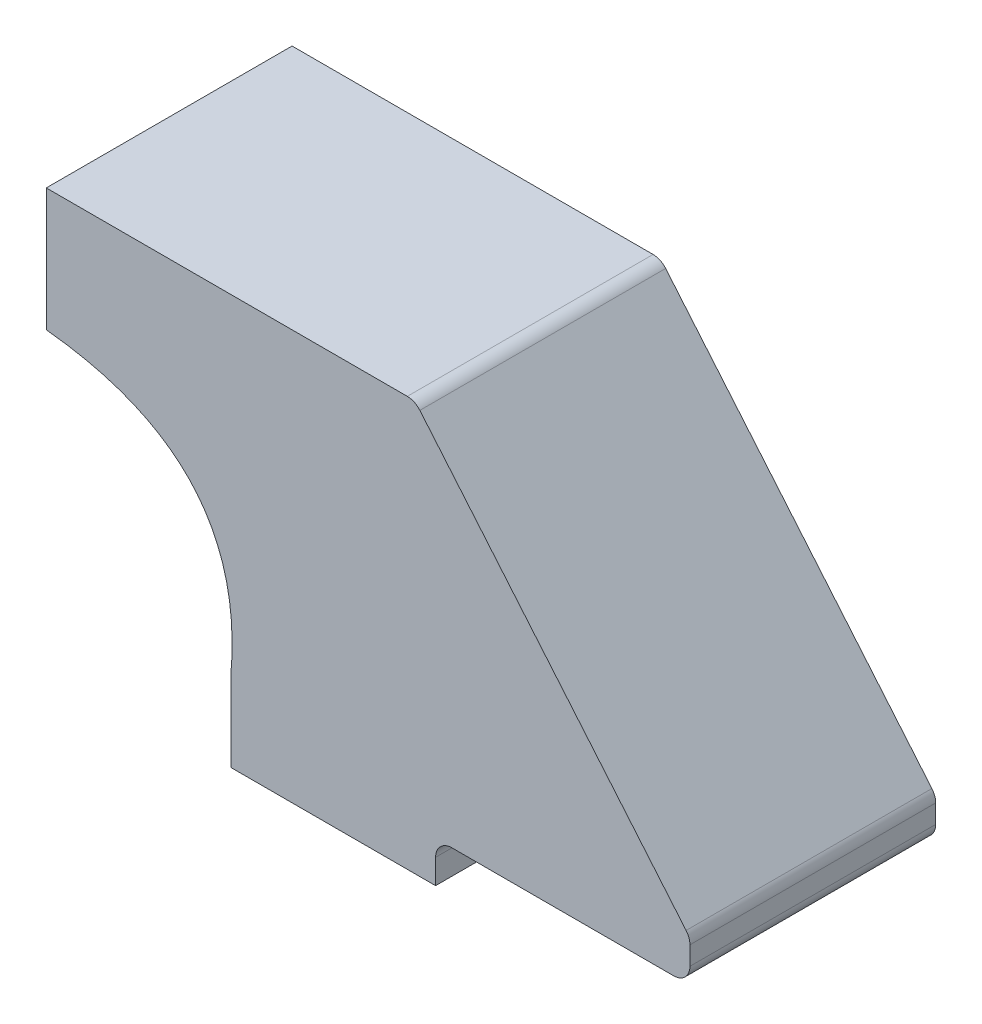
ISO-10303-21;
HEADER;
FILE_DESCRIPTION(('STEP AP214'),'2;1');
FILE_NAME('part.step','',(''),(''),'','','');
FILE_SCHEMA(('AUTOMOTIVE_DESIGN { 1 0 10303 214 1 1 1 1 }'));
ENDSEC;
DATA;
#1=APPLICATION_CONTEXT('core data for automotive mechanical design processes');
#2=APPLICATION_PROTOCOL_DEFINITION('international standard','automotive_design',2000,#1);
#3=PRODUCT_CONTEXT('',#1,'mechanical');
#4=PRODUCT('Part','Part','',(#3));
#5=PRODUCT_RELATED_PRODUCT_CATEGORY('part','',(#4));
#6=PRODUCT_DEFINITION_FORMATION('','',#4);
#7=PRODUCT_DEFINITION_CONTEXT('part definition',#1,'design');
#8=PRODUCT_DEFINITION('design','',#6,#7);
#9=PRODUCT_DEFINITION_SHAPE('','',#8);
#10=(LENGTH_UNIT() NAMED_UNIT(*) SI_UNIT(.MILLI.,.METRE.));
#11=(NAMED_UNIT(*) PLANE_ANGLE_UNIT() SI_UNIT($,.RADIAN.));
#12=(NAMED_UNIT(*) SI_UNIT($,.STERADIAN.) SOLID_ANGLE_UNIT());
#13=UNCERTAINTY_MEASURE_WITH_UNIT(LENGTH_MEASURE(1.E-05),#10,'distance_accuracy_value','');
#14=(GEOMETRIC_REPRESENTATION_CONTEXT(3) GLOBAL_UNCERTAINTY_ASSIGNED_CONTEXT((#13)) GLOBAL_UNIT_ASSIGNED_CONTEXT((#10,
#11,#12)) REPRESENTATION_CONTEXT('',''));
#15=CARTESIAN_POINT('',(0.,0.,0.));
#16=DIRECTION('',(0.,0.,1.));
#17=DIRECTION('',(1.,0.,0.));
#18=AXIS2_PLACEMENT_3D('',#15,#16,#17);
#19=CARTESIAN_POINT('',(-28.5977434712053,-19.05,38.1));
#20=CARTESIAN_POINT('',(2.69986255378224,-22.2822170331598,38.1));
#21=CARTESIAN_POINT('',(0.,-51.2255624771992,38.1));
#22=B_SPLINE_CURVE_WITH_KNOTS('',2,(#19,#20,#21),.UNSPECIFIED.,.F.,.F.,(3,3),(0.,1.),.UNSPECIFIED.);
#23=DIRECTION('',(0.,0.,-1.));
#24=VECTOR('',#23,1.);
#25=SURFACE_OF_LINEAR_EXTRUSION('',#22,#24);
#26=CARTESIAN_POINT('',(-26.4958079400741,-19.3012852246724,2.54));
#27=CARTESIAN_POINT('',(-25.9557707656117,-19.3749972889507,2.54));
#28=CARTESIAN_POINT('',(-25.4166666288395,-19.4558500524149,2.54));
#29=CARTESIAN_POINT('',(-24.339294769458,-19.6333532227759,2.54));
#30=CARTESIAN_POINT('',(-23.8010352820643,-19.7300534904347,2.54));
#31=CARTESIAN_POINT('',(-22.726857119988,-19.9404951627902,2.54));
#32=CARTESIAN_POINT('',(-22.19094420361,-20.0542661465355,2.54));
#33=CARTESIAN_POINT('',(-21.1230122561782,-20.3001806935425,2.54));
#34=CARTESIAN_POINT('',(-20.5909956160078,-20.4323346810761,2.54));
#35=CARTESIAN_POINT('',(-19.5184695832526,-20.7201501352653,2.54));
#36=CARTESIAN_POINT('',(-18.978099668573,-20.8763340203279,2.54));
#37=CARTESIAN_POINT('',(-17.9047676279952,-21.2111327289251,2.54));
#38=CARTESIAN_POINT('',(-17.3718002541145,-21.3897306548043,2.54));
#39=CARTESIAN_POINT('',(-16.3149971864087,-21.7710689894031,2.54));
#40=CARTESIAN_POINT('',(-15.7911548113677,-21.9737908029164,2.54));
#41=CARTESIAN_POINT('',(-14.7543694102743,-22.4052130995189,2.54));
#42=CARTESIAN_POINT('',(-14.2414239851874,-22.6339077926535,2.53999999999999));
#43=CARTESIAN_POINT('',(-13.2360045679206,-23.1155449071601,2.53999999999999));
#44=CARTESIAN_POINT('',(-12.7433427088365,-23.3680937266804,2.54));
#45=CARTESIAN_POINT('',(-11.773534971904,-23.9016036543832,2.54));
#46=CARTESIAN_POINT('',(-11.2963904925125,-24.1825673140414,2.54));
#47=CARTESIAN_POINT('',(-10.3606742810216,-24.7740572822391,2.54));
#48=CARTESIAN_POINT('',(-9.90210402626386,-25.0845859357396,2.54));
#49=CARTESIAN_POINT('',(-9.01114316764604,-25.7327624934599,2.54));
#50=CARTESIAN_POINT('',(-8.57854501851739,-26.0701243149015,2.54));
#51=CARTESIAN_POINT('',(-7.73819704809197,-26.774517807504,2.54));
#52=CARTESIAN_POINT('',(-7.33044621169315,-27.1415482651673,2.54));
#53=CARTESIAN_POINT('',(-6.54314195891344,-27.9044867770521,2.54));
#54=CARTESIAN_POINT('',(-6.1635777065943,-28.3003836167751,2.54000000000001));
#55=CARTESIAN_POINT('',(-5.50973185109996,-29.0360199435867,2.54000000000001));
#56=CARTESIAN_POINT('',(-5.22977254781658,-29.3707313588659,2.54));
#57=CARTESIAN_POINT('',(-4.69064949403554,-30.0564752110697,2.54));
#58=CARTESIAN_POINT('',(-4.43148390951828,-30.4075062042738,2.54));
#59=CARTESIAN_POINT('',(-3.93486758821132,-31.1245483653785,2.54));
#60=CARTESIAN_POINT('',(-3.69741482211093,-31.4905581287043,2.54));
#61=CARTESIAN_POINT('',(-3.24465178865981,-32.2362682135681,2.54));
#62=CARTESIAN_POINT('',(-3.02935270334118,-32.6159753194943,2.54));
#63=CARTESIAN_POINT('',(-2.62124381411061,-33.3873094038891,2.54));
#64=CARTESIAN_POINT('',(-2.42843573520121,-33.7789372937504,2.54));
#65=CARTESIAN_POINT('',(-2.0652185625317,-34.5724252186209,2.54));
#66=CARTESIAN_POINT('',(-1.89480927649679,-34.9742851657612,2.54));
#67=CARTESIAN_POINT('',(-1.58991206349808,-35.7511227029641,2.54));
#68=CARTESIAN_POINT('',(-1.45358652565678,-36.1253815134191,2.54));
#69=CARTESIAN_POINT('',(-1.19874454343556,-36.8799346043934,2.54));
#70=CARTESIAN_POINT('',(-1.08023040058279,-37.2602296578877,2.54));
#71=CARTESIAN_POINT('',(-0.750444123631098,-38.4087648347983,2.54));
#72=CARTESIAN_POINT('',(-0.564980306081429,-39.1845202247595,2.54));
#73=CARTESIAN_POINT('',(-0.255580736643248,-40.755484323278,2.54));
#74=CARTESIAN_POINT('',(-0.132237667139213,-41.5508071915305,2.54));
#75=CARTESIAN_POINT('',(0.00973123416477016,-42.7483248392847,2.54));
#76=CARTESIAN_POINT('',(0.0498735878991604,-43.1481164846251,2.54));
#77=CARTESIAN_POINT('',(0.116684103395654,-43.9488316581764,2.54));
#78=CARTESIAN_POINT('',(0.143352539245693,-44.3497551631959,2.54));
#79=CARTESIAN_POINT('',(0.180698431126576,-45.086608600095,2.54));
#80=CARTESIAN_POINT('',(0.193277691748724,-45.4224456958983,2.54));
#81=CARTESIAN_POINT('',(0.210031916751964,-46.0943257261361,2.54));
#82=CARTESIAN_POINT('',(0.214206961519863,-46.430368658571,2.54));
#83=CARTESIAN_POINT('',(0.21459098821829,-47.1025141793904,2.54));
#84=CARTESIAN_POINT('',(0.210798566716455,-47.4386167678557,2.54));
#85=CARTESIAN_POINT('',(0.195662953241587,-48.1106448198608,2.54));
#86=CARTESIAN_POINT('',(0.184319843025614,-48.446570285279,2.54));
#87=CARTESIAN_POINT('',(0.15445518202639,-49.1186504268928,2.54));
#88=CARTESIAN_POINT('',(0.135921956334129,-49.4548045836735,2.54));
#89=CARTESIAN_POINT('',(0.103021736347244,-49.9586976858475,2.54));
#90=CARTESIAN_POINT('',(0.0912047934665523,-50.1266073242175,2.54));
#91=CARTESIAN_POINT('',(0.0722378283837651,-50.3783775423077,2.54));
#92=CARTESIAN_POINT('',(0.0657086034207512,-50.4622849853913,2.54));
#93=CARTESIAN_POINT('',(0.0522418269266401,-50.6300668056189,2.54));
#94=CARTESIAN_POINT('',(0.0453042768016809,-50.7139411828758,2.54));
#95=CARTESIAN_POINT('',(0.0310127153121131,-50.8818148056851,2.54));
#96=CARTESIAN_POINT('',(0.0236579385392867,-50.9658139861098,2.54));
#97=CARTESIAN_POINT('',(0.0123264409846385,-51.0917859152644,2.54));
#98=CARTESIAN_POINT('',(0.00849937827909242,-51.1337721704541,2.54));
#99=CARTESIAN_POINT('',(0.000746184442811032,-51.2177355568533,2.54));
#100=CARTESIAN_POINT('',(-0.0031799468023312,-51.2597126880524,2.54));
#101=CARTESIAN_POINT('',(-0.0149439756448821,-51.3856459944654,2.54));
#102=CARTESIAN_POINT('',(-0.0227674534079408,-51.4696034972441,2.54));
#103=CARTESIAN_POINT('',(-0.0384244679292087,-51.637517413316,2.54));
#104=CARTESIAN_POINT('',(-0.046258004667978,-51.7214738266111,2.54));
#105=CARTESIAN_POINT('',(-0.0697559346057281,-51.9733442343365,2.54));
#106=CARTESIAN_POINT('',(-0.0854175622868351,-52.1412584833748,2.54));
#107=CARTESIAN_POINT('',(-0.116742722419435,-52.4770860381999,2.54));
#108=CARTESIAN_POINT('',(-0.132406254861969,-52.6449993439874,2.54));
#109=CARTESIAN_POINT('',(-0.163740666790729,-52.9809104309668,2.54));
#110=CARTESIAN_POINT('',(-0.179411546011187,-53.1489082121831,2.54));
#111=CARTESIAN_POINT('',(-0.210753462083882,-53.4849039659236,2.54));
#112=CARTESIAN_POINT('',(-0.226424498936288,-53.6529019384477,2.54));
#113=CARTESIAN_POINT('',(-0.273437433869644,-54.1568943854345,2.54));
#114=CARTESIAN_POINT('',(-0.304779293832285,-54.4928888634066,2.54));
#115=CARTESIAN_POINT('',(-0.366199500121553,-55.1513322664898,2.54));
#116=CARTESIAN_POINT('',(-0.396277845351759,-55.4737811917019,2.54));
#117=CARTESIAN_POINT('',(-0.456434558964557,-56.118679364381,2.54));
#118=CARTESIAN_POINT('',(-0.486512927347142,-56.4411286118479,2.54));
#119=CARTESIAN_POINT('',(-0.546642291580187,-57.0857336451108,2.54));
#120=CARTESIAN_POINT('',(-0.57669328742898,-57.407889430907,2.54));
#121=CARTESIAN_POINT('',(-0.636795270610364,-58.0522009163848,2.54));
#122=CARTESIAN_POINT('',(-0.666846257942957,-58.3743566160664,2.54));
#123=CARTESIAN_POINT('',(-0.756883058259493,-59.3395784252391,2.54));
#124=CARTESIAN_POINT('',(-0.816868871373646,-59.9826445347183,2.54));
#125=CARTESIAN_POINT('',(-0.93666288458301,-61.2668726891861,2.54));
#126=CARTESIAN_POINT('',(-0.996471084678479,-61.9080347341747,2.54));
#127=CARTESIAN_POINT('',(-1.11584842885532,-63.1877960711733,2.54));
#128=CARTESIAN_POINT('',(-1.17541757293669,-63.8263953631832,2.54));
#129=CARTESIAN_POINT('',(-1.23498671706094,-64.4649946551892,2.54));
#130=B_SPLINE_CURVE_WITH_KNOTS('',3,(#26,#27,#28,#29,#30,#31,#32,#33,#34,#35,#36,#37,#38,#39,
#40,#41,#42,#43,#44,#45,#46,#47,#48,#49,#50,#51,#52,#53,#54,#55,#56,#57,#58,#59,#60,#61,#62,#63,
#64,#65,#66,#67,#68,#69,#70,#71,#72,#73,#74,#75,#76,#77,#78,#79,#80,#81,#82,#83,#84,#85,#86,#87,
#88,#89,#90,#91,#92,#93,#94,#95,#96,#97,#98,#99,#100,#101,#102,#103,#104,#105,#106,#107,#108,
#109,#110,#111,#112,#113,#114,#115,#116,#117,#118,#119,#120,#121,#122,#123,#124,#125,#126,#127,
#128,#129),.UNSPECIFIED.,.F.,.F.,(4,2,2,2,2,2,2,2,2,2,2,2,2,2,2,2,2,2,2,2,2,2,2,2,2,2,2,2,2,2,2,
2,2,2,2,2,2,2,2,2,2,2,2,2,2,2,2,2,2,2,2,4),(0.,1.63514749955666,3.27554205045754,
4.91881251708361,6.5630186449295,8.25002950031331,9.9357760950722,11.6202315963421,
13.3043123279317,14.96430558758,16.6244480368573,18.2847222709594,19.9292025484174,
21.5736155978424,23.2173931673679,24.525707100587,25.833905512517,27.1419815331391,
28.4507145970962,29.7595479716188,31.0683701101735,32.2628438878356,33.4574718788287,
35.8471596836088,38.2592344979708,39.4644540558057,40.6696490959432,41.6777637978086,
42.685868856953,43.6941515040327,44.7024232338456,45.7123390379198,46.2173067327811,
46.4697890364916,46.7222704707868,46.9752310867847,47.1017119113925,47.2281928820704,
47.4811565868982,47.7341198035832,48.2400489885587,48.7459758795682,49.2521571504102,
49.7583390361132,50.7706983660357,51.7422446315126,52.7137918660509,53.684454894119,
54.6551176625889,56.5926911116277,58.5245275691452,60.4486423911192),.UNSPECIFIED.);
#131=CARTESIAN_POINT('',(-26.0577434712053,-19.3626774049444,2.53999999999997));
#132=VERTEX_POINT('',#131);
#133=CARTESIAN_POINT('',(0.,-51.2255624771992,2.54));
#134=VERTEX_POINT('',#133);
#135=EDGE_CURVE('E423',#132,#134,#130,.T.);
#136=ORIENTED_EDGE('',*,*,#135,.F.);
#137=DIRECTION('',(0.,0.,-1.));
#138=VECTOR('',#137,1.);
#139=CARTESIAN_POINT('',(-26.0577434712053,-19.3626774049444,35.56));
#140=LINE('',#139,#138);
#141=CARTESIAN_POINT('',(-26.0577434712053,-19.3626774049444,35.56));
#142=VERTEX_POINT('',#141);
#143=EDGE_CURVE('E189',#142,#132,#140,.T.);
#144=ORIENTED_EDGE('',*,*,#143,.F.);
#145=CARTESIAN_POINT('',(-26.0577434712053,-19.3626774049444,35.56));
#146=CARTESIAN_POINT('',(-25.445318622715,-19.4508219604254,35.56));
#147=CARTESIAN_POINT('',(-24.8341690756254,-19.5483484009053,35.56));
#148=CARTESIAN_POINT('',(-23.6119762934163,-19.764666402573,35.56));
#149=CARTESIAN_POINT('',(-23.000954509338,-19.8835787885162,35.56));
#150=CARTESIAN_POINT('',(-21.7817850744743,-20.1446061402233,35.56));
#151=CARTESIAN_POINT('',(-21.1736530727,-20.2867947795604,35.56));
#152=CARTESIAN_POINT('',(-19.9631109866169,-20.5964203953035,35.56));
#153=CARTESIAN_POINT('',(-19.360707866321,-20.7638847397435,35.56));
#154=CARTESIAN_POINT('',(-18.1520025660107,-21.1299367303092,35.56));
#155=CARTESIAN_POINT('',(-17.5458699246526,-21.3290876954924,35.56));
#156=CARTESIAN_POINT('',(-16.3455422514703,-21.7582216415561,35.56));
#157=CARTESIAN_POINT('',(-15.7513312943246,-21.9881598359001,35.56));
#158=CARTESIAN_POINT('',(-14.5779166089599,-22.4812834266235,35.56));
#159=CARTESIAN_POINT('',(-13.9986902708036,-22.7444147286965,35.56));
#160=CARTESIAN_POINT('',(-12.8583638597434,-23.3064296173739,35.56));
#161=CARTESIAN_POINT('',(-12.2972491116692,-23.6052832863234,35.56));
#162=CARTESIAN_POINT('',(-11.1852103717051,-24.2477719124819,35.56));
#163=CARTESIAN_POINT('',(-10.634754710607,-24.5922220100769,35.56));
#164=CARTESIAN_POINT('',(-9.56173511779487,-25.3223495315745,35.56));
#165=CARTESIAN_POINT('',(-9.03917372401397,-25.7080306972928,35.56));
#166=CARTESIAN_POINT('',(-8.03084278482968,-26.5184179245708,35.56));
#167=CARTESIAN_POINT('',(-7.54484725847523,-26.942840843158,35.56));
#168=CARTESIAN_POINT('',(-6.844679136364,-27.6095446582624,35.56));
#169=CARTESIAN_POINT('',(-6.6160700148165,-27.8368179220066,35.56));
#170=CARTESIAN_POINT('',(-6.16903153021002,-28.3011547687067,35.56));
#171=CARTESIAN_POINT('',(-5.95060146404475,-28.5382176733147,35.56));
#172=CARTESIAN_POINT('',(-5.45149423954803,-29.1046468286921,35.56));
#173=CARTESIAN_POINT('',(-5.17511887816372,-29.4378194476253,35.56));
#174=CARTESIAN_POINT('',(-4.64287883459588,-30.120182491696,35.56));
#175=CARTESIAN_POINT('',(-4.38701540293546,-30.4693738913915,35.56));
#176=CARTESIAN_POINT('',(-3.89669149018374,-31.182436745962,35.56));
#177=CARTESIAN_POINT('',(-3.66222954597202,-31.5463071948422,35.56));
#178=CARTESIAN_POINT('',(-3.21479852648344,-32.2879865464561,35.56));
#179=CARTESIAN_POINT('',(-3.00187219187933,-32.6658212109335,35.56));
#180=CARTESIAN_POINT('',(-2.59822632563413,-33.4331847956511,35.56));
#181=CARTESIAN_POINT('',(-2.40750812017844,-33.8227144125243,35.56));
#182=CARTESIAN_POINT('',(-2.04816411861858,-34.6118405563179,35.56));
#183=CARTESIAN_POINT('',(-1.8795394172039,-35.0114375808897,35.56));
#184=CARTESIAN_POINT('',(-1.57724920205004,-35.7851433538693,35.56));
#185=CARTESIAN_POINT('',(-1.44183664211348,-36.1585717345515,35.56));
#186=CARTESIAN_POINT('',(-1.18870748060374,-36.9113971814896,35.56));
#187=CARTESIAN_POINT('',(-1.07099316061851,-37.2907950103508,35.56));
#188=CARTESIAN_POINT('',(-0.743483606361877,-38.4364072495384,35.56));
#189=CARTESIAN_POINT('',(-0.559313549979998,-39.2100617629157,35.56));
#190=CARTESIAN_POINT('',(-0.253052914095378,-40.7716620829401,35.56));
#191=CARTESIAN_POINT('',(-0.131153191224365,-41.559644250962,35.56));
#192=CARTESIAN_POINT('',(0.0563721911275352,-43.1420557092505,35.56));
#193=CARTESIAN_POINT('',(0.1220062728133,-43.9364840166397,35.56));
#194=CARTESIAN_POINT('',(0.190543355707248,-45.2756119531217,35.56));
#195=CARTESIAN_POINT('',(0.206731841372172,-45.8197014794603,35.56));
#196=CARTESIAN_POINT('',(0.217767616616003,-46.9080460356857,35.56));
#197=CARTESIAN_POINT('',(0.21261699052243,-47.4523010442163,35.56));
#198=CARTESIAN_POINT('',(0.182901085652123,-48.5354298531144,35.56));
#199=CARTESIAN_POINT('',(0.158507930713822,-49.0743086713822,35.56));
#200=CARTESIAN_POINT('',(0.0920868950302436,-50.1509123013231,35.56));
#201=CARTESIAN_POINT('',(0.0500614422016279,-50.6886372616367,35.56));
#202=CARTESIAN_POINT('',(0.,-51.2255624771992,35.56));
#203=B_SPLINE_CURVE_WITH_KNOTS('',3,(#145,#146,#147,#148,#149,#150,#151,#152,#153,#154,#155,
#156,#157,#158,#159,#160,#161,#162,#163,#164,#165,#166,#167,#168,#169,#170,#171,#172,#173,#174,
#175,#176,#177,#178,#179,#180,#181,#182,#183,#184,#185,#186,#187,#188,#189,#190,#191,#192,#193,
#194,#195,#196,#197,#198,#199,#200,#201,#202),.UNSPECIFIED.,.F.,.F.,(4,2,2,2,2,2,2,2,2,2,2,2,2,
2,2,2,2,2,2,2,2,2,2,2,2,2,2,2,4),(0.,1.85624480614655,3.72332663699667,5.59643663226554,
7.47158954029138,9.38484863965487,11.2953541400521,13.2027853967572,15.1086302183605,
17.0548845217535,19.0013156024513,20.9345135993706,21.9013287624093,22.8680770445389,
24.1659168526294,25.4638357242893,26.7616657966947,28.062023048726,29.3624579133905,
30.6629571876863,31.8541575129284,33.0455112716311,35.4281504050151,37.8180490851815,
40.2075899673697,41.8401851332693,43.4726208369174,45.0906177906097,46.7083920238602),.UNSPECIFIED.);
#204=CARTESIAN_POINT('',(0.,-51.2255624771992,35.56));
#205=VERTEX_POINT('',#204);
#206=EDGE_CURVE('E328',#142,#205,#203,.T.);
#207=ORIENTED_EDGE('',*,*,#206,.T.);
#208=DIRECTION('',(0.,0.,-1.));
#209=VECTOR('',#208,1.);
#210=CARTESIAN_POINT('',(0.,-51.2255624771992,38.1));
#211=LINE('',#210,#209);
#212=CARTESIAN_POINT('',(0.,-51.2255624771992,38.1));
#213=VERTEX_POINT('',#212);
#214=EDGE_CURVE('E265',#213,#205,#211,.T.);
#215=ORIENTED_EDGE('',*,*,#214,.F.);
#216=CARTESIAN_POINT('',(-28.5977434712053,-19.05,38.1));
#217=VERTEX_POINT('',#216);
#218=EDGE_CURVE('E121',#217,#213,#22,.T.);
#219=ORIENTED_EDGE('',*,*,#218,.F.);
#220=DIRECTION('',(0.,0.,-1.));
#221=VECTOR('',#220,1.);
#222=CARTESIAN_POINT('',(-28.5977434712053,-19.05,38.1));
#223=LINE('',#222,#221);
#224=CARTESIAN_POINT('',(-28.5977434712053,-19.05,0.));
#225=VERTEX_POINT('',#224);
#226=EDGE_CURVE('E48',#217,#225,#223,.T.);
#227=ORIENTED_EDGE('',*,*,#226,.T.);
#228=CARTESIAN_POINT('',(-28.5977434712053,-19.05,0.));
#229=CARTESIAN_POINT('',(2.69986255378224,-22.2822170331598,0.));
#230=CARTESIAN_POINT('',(0.,-51.2255624771992,0.));
#231=B_SPLINE_CURVE_WITH_KNOTS('',2,(#228,#229,#230),.UNSPECIFIED.,.F.,.F.,(3,3),(0.,1.),.UNSPECIFIED.);
#232=CARTESIAN_POINT('',(0.,-51.2255624771992,0.));
#233=VERTEX_POINT('',#232);
#234=EDGE_CURVE('E188',#225,#233,#231,.T.);
#235=ORIENTED_EDGE('',*,*,#234,.T.);
#236=EDGE_CURVE('E264',#134,#233,#211,.T.);
#237=ORIENTED_EDGE('',*,*,#236,.F.);
#238=EDGE_LOOP('',(#136,#144,#207,#215,#219,#227,#235,#237));
#239=FACE_BOUND('',#238,.T.);
#240=ADVANCED_FACE('F39',(#239),#25,.F.);
#241=CARTESIAN_POINT('',(0.,-51.2255624771992,38.1));
#242=DIRECTION('',(1.,0.,0.));
#243=DIRECTION('',(0.,0.,-1.));
#244=AXIS2_PLACEMENT_3D('',#241,#242,#243);
#245=PLANE('',#244);
#246=DIRECTION('',(0.,-1.,0.));
#247=VECTOR('',#246,1.);
#248=CARTESIAN_POINT('',(0.,-51.2255624771992,2.54));
#249=LINE('',#248,#247);
#250=CARTESIAN_POINT('',(0.,-60.96,2.54));
#251=VERTEX_POINT('',#250);
#252=EDGE_CURVE('E432',#134,#251,#249,.T.);
#253=ORIENTED_EDGE('',*,*,#252,.F.);
#254=ORIENTED_EDGE('',*,*,#236,.T.);
#255=DIRECTION('',(0.,-1.,0.));
#256=VECTOR('',#255,1.);
#257=CARTESIAN_POINT('',(0.,-51.2255624771992,0.));
#258=LINE('',#257,#256);
#259=CARTESIAN_POINT('',(0.,-63.5,0.));
#260=VERTEX_POINT('',#259);
#261=EDGE_CURVE('E195',#233,#260,#258,.T.);
#262=ORIENTED_EDGE('',*,*,#261,.T.);
#263=DIRECTION('',(0.,0.,-1.));
#264=VECTOR('',#263,1.);
#265=CARTESIAN_POINT('',(0.,-63.5,38.1));
#266=LINE('',#265,#264);
#267=CARTESIAN_POINT('',(0.,-63.5,38.1));
#268=VERTEX_POINT('',#267);
#269=EDGE_CURVE('E260',#268,#260,#266,.T.);
#270=ORIENTED_EDGE('',*,*,#269,.F.);
#271=DIRECTION('',(0.,-1.,0.));
#272=VECTOR('',#271,1.);
#273=CARTESIAN_POINT('',(0.,-51.2255624771992,38.1));
#274=LINE('',#273,#272);
#275=EDGE_CURVE('E293',#213,#268,#274,.T.);
#276=ORIENTED_EDGE('',*,*,#275,.F.);
#277=ORIENTED_EDGE('',*,*,#214,.T.);
#278=DIRECTION('',(0.,-1.,0.));
#279=VECTOR('',#278,1.);
#280=CARTESIAN_POINT('',(0.,-51.2255624771992,35.56));
#281=LINE('',#280,#279);
#282=CARTESIAN_POINT('',(0.,-60.96,35.56));
#283=VERTEX_POINT('',#282);
#284=EDGE_CURVE('E443',#205,#283,#281,.T.);
#285=ORIENTED_EDGE('',*,*,#284,.T.);
#286=DIRECTION('',(0.,0.,-1.));
#287=VECTOR('',#286,1.);
#288=CARTESIAN_POINT('',(0.,-60.96,38.1));
#289=LINE('',#288,#287);
#290=EDGE_CURVE('E439',#283,#251,#289,.T.);
#291=ORIENTED_EDGE('',*,*,#290,.T.);
#292=EDGE_LOOP('',(#253,#254,#262,#270,#276,#277,#285,#291));
#293=FACE_BOUND('',#292,.T.);
#294=ADVANCED_FACE('F283',(#293),#245,.F.);
#295=CARTESIAN_POINT('',(-28.5977434712053,0.,38.1));
#296=DIRECTION('',(1.,0.,0.));
#297=DIRECTION('',(0.,1.,0.));
#298=AXIS2_PLACEMENT_3D('',#295,#296,#297);
#299=PLANE('',#298);
#300=DIRECTION('',(0.,-1.,0.));
#301=VECTOR('',#300,1.);
#302=CARTESIAN_POINT('',(-28.5977434712053,0.,0.));
#303=LINE('',#302,#301);
#304=CARTESIAN_POINT('',(-28.5977434712053,0.,0.));
#305=VERTEX_POINT('',#304);
#306=EDGE_CURVE('E184',#305,#225,#303,.T.);
#307=ORIENTED_EDGE('',*,*,#306,.T.);
#308=ORIENTED_EDGE('',*,*,#226,.F.);
#309=DIRECTION('',(0.,-1.,0.));
#310=VECTOR('',#309,1.);
#311=CARTESIAN_POINT('',(-28.5977434712053,0.,38.1));
#312=LINE('',#311,#310);
#313=CARTESIAN_POINT('',(-28.5977434712053,0.,38.1));
#314=VERTEX_POINT('',#313);
#315=EDGE_CURVE('E229',#314,#217,#312,.T.);
#316=ORIENTED_EDGE('',*,*,#315,.F.);
#317=DIRECTION('',(0.,0.,-1.));
#318=VECTOR('',#317,1.);
#319=CARTESIAN_POINT('',(-28.5977434712053,0.,38.1));
#320=LINE('',#319,#318);
#321=EDGE_CURVE('E180',#314,#305,#320,.T.);
#322=ORIENTED_EDGE('',*,*,#321,.T.);
#323=EDGE_LOOP('',(#307,#308,#316,#322));
#324=FACE_BOUND('',#323,.T.);
#325=ADVANCED_FACE('F41',(#324),#299,.F.);
#326=CARTESIAN_POINT('',(0.,-63.5,38.1));
#327=DIRECTION('',(0.,1.,0.));
#328=DIRECTION('',(0.,0.,1.));
#329=AXIS2_PLACEMENT_3D('',#326,#327,#328);
#330=PLANE('',#329);
#331=DIRECTION('',(1.,0.,0.));
#332=VECTOR('',#331,1.);
#333=CARTESIAN_POINT('',(0.,-63.5,0.));
#334=LINE('',#333,#332);
#335=CARTESIAN_POINT('',(31.75,-63.5,0.));
#336=VERTEX_POINT('',#335);
#337=EDGE_CURVE('E201',#260,#336,#334,.T.);
#338=ORIENTED_EDGE('',*,*,#337,.T.);
#339=DIRECTION('',(0.,0.,-1.));
#340=VECTOR('',#339,1.);
#341=CARTESIAN_POINT('',(31.75,-63.5,38.1));
#342=LINE('',#341,#340);
#343=CARTESIAN_POINT('',(31.75,-63.5,38.1));
#344=VERTEX_POINT('',#343);
#345=EDGE_CURVE('E256',#344,#336,#342,.T.);
#346=ORIENTED_EDGE('',*,*,#345,.F.);
#347=DIRECTION('',(1.,0.,0.));
#348=VECTOR('',#347,1.);
#349=CARTESIAN_POINT('',(0.,-63.5,38.1));
#350=LINE('',#349,#348);
#351=EDGE_CURVE('E289',#268,#344,#350,.T.);
#352=ORIENTED_EDGE('',*,*,#351,.F.);
#353=ORIENTED_EDGE('',*,*,#269,.T.);
#354=EDGE_LOOP('',(#338,#346,#352,#353));
#355=FACE_BOUND('',#354,.T.);
#356=ADVANCED_FACE('F287',(#355),#330,.F.);
#357=CARTESIAN_POINT('',(31.75,-63.5,38.1));
#358=DIRECTION('',(-1.,0.,0.));
#359=DIRECTION('',(0.,0.,1.));
#360=AXIS2_PLACEMENT_3D('',#357,#358,#359);
#361=PLANE('',#360);
#362=DIRECTION('',(0.,1.,0.));
#363=VECTOR('',#362,1.);
#364=CARTESIAN_POINT('',(31.75,-63.5,0.));
#365=LINE('',#364,#363);
#366=CARTESIAN_POINT('',(31.75,-59.69,0.));
#367=VERTEX_POINT('',#366);
#368=EDGE_CURVE('E204',#336,#367,#365,.T.);
#369=ORIENTED_EDGE('',*,*,#368,.T.);
#370=DIRECTION('',(0.,0.,-1.));
#371=VECTOR('',#370,1.);
#372=CARTESIAN_POINT('',(31.75,-59.69,38.1));
#373=LINE('',#372,#371);
#374=CARTESIAN_POINT('',(31.75,-59.69,38.1));
#375=VERTEX_POINT('',#374);
#376=EDGE_CURVE('E252',#375,#367,#373,.T.);
#377=ORIENTED_EDGE('',*,*,#376,.F.);
#378=DIRECTION('',(0.,1.,0.));
#379=VECTOR('',#378,1.);
#380=CARTESIAN_POINT('',(31.75,-63.5,38.1));
#381=LINE('',#380,#379);
#382=EDGE_CURVE('E292',#344,#375,#381,.T.);
#383=ORIENTED_EDGE('',*,*,#382,.F.);
#384=ORIENTED_EDGE('',*,*,#345,.T.);
#385=EDGE_LOOP('',(#369,#377,#383,#384));
#386=FACE_BOUND('',#385,.T.);
#387=ADVANCED_FACE('F348',(#386),#361,.F.);
#388=CARTESIAN_POINT('',(34.29,-59.69,38.1));
#389=DIRECTION('',(0.,0.,-1.));
#390=DIRECTION('',(-1.,0.,0.));
#391=AXIS2_PLACEMENT_3D('',#388,#389,#390);
#392=CYLINDRICAL_SURFACE('',#391,2.54);
#393=CARTESIAN_POINT('',(34.29,-59.69,0.));
#394=DIRECTION('',(0.,0.,-1.));
#395=DIRECTION('',(-1.,0.,0.));
#396=AXIS2_PLACEMENT_3D('',#393,#394,#395);
#397=CIRCLE('',#396,2.54);
#398=CARTESIAN_POINT('',(34.29,-57.15,0.));
#399=VERTEX_POINT('',#398);
#400=EDGE_CURVE('E207',#367,#399,#397,.T.);
#401=ORIENTED_EDGE('',*,*,#400,.T.);
#402=DIRECTION('',(0.,0.,-1.));
#403=VECTOR('',#402,1.);
#404=CARTESIAN_POINT('',(34.29,-57.15,38.1));
#405=LINE('',#404,#403);
#406=CARTESIAN_POINT('',(34.29,-57.15,38.1));
#407=VERTEX_POINT('',#406);
#408=EDGE_CURVE('E248',#407,#399,#405,.T.);
#409=ORIENTED_EDGE('',*,*,#408,.F.);
#410=CARTESIAN_POINT('',(34.29,-59.69,38.1));
#411=DIRECTION('',(0.,0.,-1.));
#412=DIRECTION('',(-1.,0.,0.));
#413=AXIS2_PLACEMENT_3D('',#410,#411,#412);
#414=CIRCLE('',#413,2.54);
#415=EDGE_CURVE('E297',#375,#407,#414,.T.);
#416=ORIENTED_EDGE('',*,*,#415,.F.);
#417=ORIENTED_EDGE('',*,*,#376,.T.);
#418=EDGE_LOOP('',(#401,#409,#416,#417));
#419=FACE_BOUND('',#418,.T.);
#420=ADVANCED_FACE('F351',(#419),#392,.F.);
#421=CARTESIAN_POINT('',(68.638517792601,-57.15,38.1));
#422=DIRECTION('',(0.,1.,0.));
#423=DIRECTION('',(-1.,0.,0.));
#424=AXIS2_PLACEMENT_3D('',#421,#422,#423);
#425=PLANE('',#424);
#426=DIRECTION('',(1.,0.,0.));
#427=VECTOR('',#426,1.);
#428=CARTESIAN_POINT('',(68.638517792601,-57.15,0.));
#429=LINE('',#428,#427);
#430=CARTESIAN_POINT('',(68.638517792601,-57.15,0.));
#431=VERTEX_POINT('',#430);
#432=EDGE_CURVE('E210',#399,#431,#429,.T.);
#433=ORIENTED_EDGE('',*,*,#432,.T.);
#434=DIRECTION('',(0.,0.,-1.));
#435=VECTOR('',#434,1.);
#436=CARTESIAN_POINT('',(68.638517792601,-57.15,38.1));
#437=LINE('',#436,#435);
#438=CARTESIAN_POINT('',(68.638517792601,-57.15,38.1));
#439=VERTEX_POINT('',#438);
#440=EDGE_CURVE('E244',#439,#431,#437,.T.);
#441=ORIENTED_EDGE('',*,*,#440,.F.);
#442=DIRECTION('',(1.,0.,0.));
#443=VECTOR('',#442,1.);
#444=CARTESIAN_POINT('',(68.638517792601,-57.15,38.1));
#445=LINE('',#444,#443);
#446=EDGE_CURVE('E304',#407,#439,#445,.T.);
#447=ORIENTED_EDGE('',*,*,#446,.F.);
#448=ORIENTED_EDGE('',*,*,#408,.T.);
#449=EDGE_LOOP('',(#433,#441,#447,#448));
#450=FACE_BOUND('',#449,.T.);
#451=ADVANCED_FACE('F355',(#450),#425,.F.);
#452=CARTESIAN_POINT('',(68.638517792601,-54.61,38.1));
#453=DIRECTION('',(0.,0.,-1.));
#454=DIRECTION('',(-1.,0.,0.));
#455=AXIS2_PLACEMENT_3D('',#452,#453,#454);
#456=CYLINDRICAL_SURFACE('',#455,2.54);
#457=CARTESIAN_POINT('',(68.638517792601,-54.61,0.));
#458=DIRECTION('',(0.,0.,1.));
#459=DIRECTION('',(-1.,0.,0.));
#460=AXIS2_PLACEMENT_3D('',#457,#458,#459);
#461=CIRCLE('',#460,2.54);
#462=CARTESIAN_POINT('',(71.178517792601,-54.61,0.));
#463=VERTEX_POINT('',#462);
#464=EDGE_CURVE('E213',#431,#463,#461,.T.);
#465=ORIENTED_EDGE('',*,*,#464,.T.);
#466=DIRECTION('',(0.,0.,-1.));
#467=VECTOR('',#466,1.);
#468=CARTESIAN_POINT('',(71.178517792601,-54.61,38.1));
#469=LINE('',#468,#467);
#470=CARTESIAN_POINT('',(71.178517792601,-54.61,38.1));
#471=VERTEX_POINT('',#470);
#472=EDGE_CURVE('E240',#471,#463,#469,.T.);
#473=ORIENTED_EDGE('',*,*,#472,.F.);
#474=CARTESIAN_POINT('',(68.638517792601,-54.61,38.1));
#475=DIRECTION('',(0.,0.,1.));
#476=DIRECTION('',(-1.,0.,0.));
#477=AXIS2_PLACEMENT_3D('',#474,#475,#476);
#478=CIRCLE('',#477,2.54);
#479=EDGE_CURVE('E307',#439,#471,#478,.T.);
#480=ORIENTED_EDGE('',*,*,#479,.F.);
#481=ORIENTED_EDGE('',*,*,#440,.T.);
#482=EDGE_LOOP('',(#465,#473,#480,#481));
#483=FACE_BOUND('',#482,.T.);
#484=ADVANCED_FACE('F359',(#483),#456,.T.);
#485=CARTESIAN_POINT('',(71.178517792601,-51.7244843950362,38.1));
#486=DIRECTION('',(-1.,0.,0.));
#487=DIRECTION('',(0.,0.,1.));
#488=AXIS2_PLACEMENT_3D('',#485,#486,#487);
#489=PLANE('',#488);
#490=DIRECTION('',(0.,1.,0.));
#491=VECTOR('',#490,1.);
#492=CARTESIAN_POINT('',(71.178517792601,-51.7244843950362,0.));
#493=LINE('',#492,#491);
#494=CARTESIAN_POINT('',(71.178517792601,-51.7244843950362,0.));
#495=VERTEX_POINT('',#494);
#496=EDGE_CURVE('E216',#463,#495,#493,.T.);
#497=ORIENTED_EDGE('',*,*,#496,.T.);
#498=DIRECTION('',(0.,0.,-1.));
#499=VECTOR('',#498,1.);
#500=CARTESIAN_POINT('',(71.178517792601,-51.7244843950362,38.1));
#501=LINE('',#500,#499);
#502=CARTESIAN_POINT('',(71.178517792601,-51.7244843950362,38.1));
#503=VERTEX_POINT('',#502);
#504=EDGE_CURVE('E236',#503,#495,#501,.T.);
#505=ORIENTED_EDGE('',*,*,#504,.F.);
#506=DIRECTION('',(0.,1.,0.));
#507=VECTOR('',#506,1.);
#508=CARTESIAN_POINT('',(71.178517792601,-51.7244843950362,38.1));
#509=LINE('',#508,#507);
#510=EDGE_CURVE('E310',#471,#503,#509,.T.);
#511=ORIENTED_EDGE('',*,*,#510,.F.);
#512=ORIENTED_EDGE('',*,*,#472,.T.);
#513=EDGE_LOOP('',(#497,#505,#511,#512));
#514=FACE_BOUND('',#513,.T.);
#515=ADVANCED_FACE('F318',(#514),#489,.F.);
#516=CARTESIAN_POINT('',(68.638517792601,-51.7244843950361,38.1));
#517=DIRECTION('',(0.,0.,-1.));
#518=DIRECTION('',(-1.,0.,0.));
#519=AXIS2_PLACEMENT_3D('',#516,#517,#518);
#520=CYLINDRICAL_SURFACE('',#519,2.54);
#521=CARTESIAN_POINT('',(68.638517792601,-51.7244843950361,0.));
#522=DIRECTION('',(0.,0.,1.));
#523=DIRECTION('',(-1.,0.,0.));
#524=AXIS2_PLACEMENT_3D('',#521,#522,#523);
#525=CIRCLE('',#524,2.54);
#526=CARTESIAN_POINT('',(70.5842706781232,-50.0918038664323,0.));
#527=VERTEX_POINT('',#526);
#528=EDGE_CURVE('E219',#495,#527,#525,.T.);
#529=ORIENTED_EDGE('',*,*,#528,.T.);
#530=DIRECTION('',(0.,0.,-1.));
#531=VECTOR('',#530,1.);
#532=CARTESIAN_POINT('',(70.5842706781232,-50.0918038664323,38.1));
#533=LINE('',#532,#531);
#534=CARTESIAN_POINT('',(70.5842706781232,-50.0918038664323,38.1));
#535=VERTEX_POINT('',#534);
#536=EDGE_CURVE('E173',#535,#527,#533,.T.);
#537=ORIENTED_EDGE('',*,*,#536,.F.);
#538=CARTESIAN_POINT('',(68.638517792601,-51.7244843950361,38.1));
#539=DIRECTION('',(0.,0.,1.));
#540=DIRECTION('',(-1.,0.,0.));
#541=AXIS2_PLACEMENT_3D('',#538,#539,#540);
#542=CIRCLE('',#541,2.54);
#543=EDGE_CURVE('E159',#503,#535,#542,.T.);
#544=ORIENTED_EDGE('',*,*,#543,.F.);
#545=ORIENTED_EDGE('',*,*,#504,.T.);
#546=EDGE_LOOP('',(#529,#537,#544,#545));
#547=FACE_BOUND('',#546,.T.);
#548=ADVANCED_FACE('F322',(#547),#520,.T.);
#549=CARTESIAN_POINT('',(29.3135879626032,-0.907319471396187,38.1));
#550=DIRECTION('',(-0.766044443118974,-0.642787609686544,0.));
#551=DIRECTION('',(0.642787609686544,-0.766044443118974,0.));
#552=AXIS2_PLACEMENT_3D('',#549,#550,#551);
#553=PLANE('',#552);
#554=DIRECTION('',(-0.642787609686544,0.766044443118974,0.));
#555=VECTOR('',#554,1.);
#556=CARTESIAN_POINT('',(29.3135879626032,-0.907319471396187,0.));
#557=LINE('',#556,#555);
#558=CARTESIAN_POINT('',(29.3135879626032,-0.907319471396188,0.));
#559=VERTEX_POINT('',#558);
#560=EDGE_CURVE('E169',#527,#559,#557,.T.);
#561=ORIENTED_EDGE('',*,*,#560,.T.);
#562=DIRECTION('',(0.,0.,-1.));
#563=VECTOR('',#562,1.);
#564=CARTESIAN_POINT('',(29.3135879626032,-0.907319471396188,38.1));
#565=LINE('',#564,#563);
#566=CARTESIAN_POINT('',(29.3135879626032,-0.907319471396188,38.1));
#567=VERTEX_POINT('',#566);
#568=EDGE_CURVE('E166',#567,#559,#565,.T.);
#569=ORIENTED_EDGE('',*,*,#568,.F.);
#570=DIRECTION('',(-0.642787609686544,0.766044443118974,0.));
#571=VECTOR('',#570,1.);
#572=CARTESIAN_POINT('',(29.3135879626032,-0.907319471396187,38.1));
#573=LINE('',#572,#571);
#574=EDGE_CURVE('E152',#535,#567,#573,.T.);
#575=ORIENTED_EDGE('',*,*,#574,.F.);
#576=ORIENTED_EDGE('',*,*,#536,.T.);
#577=EDGE_LOOP('',(#561,#569,#575,#576));
#578=FACE_BOUND('',#577,.T.);
#579=ADVANCED_FACE('F167',(#578),#553,.F.);
#580=CARTESIAN_POINT('',(27.367835077081,-2.54,38.1));
#581=DIRECTION('',(0.,0.,-1.));
#582=DIRECTION('',(-1.,0.,0.));
#583=AXIS2_PLACEMENT_3D('',#580,#581,#582);
#584=CYLINDRICAL_SURFACE('',#583,2.54);
#585=CARTESIAN_POINT('',(27.367835077081,-2.54,0.));
#586=DIRECTION('',(0.,0.,1.));
#587=DIRECTION('',(-1.,0.,0.));
#588=AXIS2_PLACEMENT_3D('',#585,#586,#587);
#589=CIRCLE('',#588,2.54);
#590=CARTESIAN_POINT('',(27.367835077081,0.,0.));
#591=VERTEX_POINT('',#590);
#592=EDGE_CURVE('E224',#559,#591,#589,.T.);
#593=ORIENTED_EDGE('',*,*,#592,.T.);
#594=DIRECTION('',(0.,0.,-1.));
#595=VECTOR('',#594,1.);
#596=CARTESIAN_POINT('',(27.367835077081,0.,38.1));
#597=LINE('',#596,#595);
#598=CARTESIAN_POINT('',(27.367835077081,0.,38.1));
#599=VERTEX_POINT('',#598);
#600=EDGE_CURVE('E174',#599,#591,#597,.T.);
#601=ORIENTED_EDGE('',*,*,#600,.F.);
#602=CARTESIAN_POINT('',(27.367835077081,-2.54,38.1));
#603=DIRECTION('',(0.,0.,1.));
#604=DIRECTION('',(-1.,0.,0.));
#605=AXIS2_PLACEMENT_3D('',#602,#603,#604);
#606=CIRCLE('',#605,2.54);
#607=EDGE_CURVE('E156',#567,#599,#606,.T.);
#608=ORIENTED_EDGE('',*,*,#607,.F.);
#609=ORIENTED_EDGE('',*,*,#568,.T.);
#610=EDGE_LOOP('',(#593,#601,#608,#609));
#611=FACE_BOUND('',#610,.T.);
#612=ADVANCED_FACE('F176',(#611),#584,.T.);
#613=CARTESIAN_POINT('',(-28.5977434712053,0.,38.1));
#614=DIRECTION('',(0.,-1.,0.));
#615=DIRECTION('',(0.,0.,-1.));
#616=AXIS2_PLACEMENT_3D('',#613,#614,#615);
#617=PLANE('',#616);
#618=DIRECTION('',(-1.,0.,0.));
#619=VECTOR('',#618,1.);
#620=CARTESIAN_POINT('',(-28.5977434712053,0.,0.));
#621=LINE('',#620,#619);
#622=EDGE_CURVE('E112',#591,#305,#621,.T.);
#623=ORIENTED_EDGE('',*,*,#622,.T.);
#624=ORIENTED_EDGE('',*,*,#321,.F.);
#625=DIRECTION('',(-1.,0.,0.));
#626=VECTOR('',#625,1.);
#627=CARTESIAN_POINT('',(-28.5977434712053,0.,38.1));
#628=LINE('',#627,#626);
#629=EDGE_CURVE('E64',#599,#314,#628,.T.);
#630=ORIENTED_EDGE('',*,*,#629,.F.);
#631=ORIENTED_EDGE('',*,*,#600,.T.);
#632=EDGE_LOOP('',(#623,#624,#630,#631));
#633=FACE_BOUND('',#632,.T.);
#634=ADVANCED_FACE('F323',(#633),#617,.F.);
#635=CARTESIAN_POINT('',(-5.7995045909102,-28.7099991358797,38.1));
#636=DIRECTION('',(0.,0.,1.));
#637=DIRECTION('',(1.,0.,0.));
#638=AXIS2_PLACEMENT_3D('',#635,#636,#637);
#639=PLANE('',#638);
#640=ORIENTED_EDGE('',*,*,#315,.T.);
#641=ORIENTED_EDGE('',*,*,#218,.T.);
#642=ORIENTED_EDGE('',*,*,#275,.T.);
#643=ORIENTED_EDGE('',*,*,#351,.T.);
#644=ORIENTED_EDGE('',*,*,#382,.T.);
#645=ORIENTED_EDGE('',*,*,#415,.T.);
#646=ORIENTED_EDGE('',*,*,#446,.T.);
#647=ORIENTED_EDGE('',*,*,#479,.T.);
#648=ORIENTED_EDGE('',*,*,#510,.T.);
#649=ORIENTED_EDGE('',*,*,#543,.T.);
#650=ORIENTED_EDGE('',*,*,#574,.T.);
#651=ORIENTED_EDGE('',*,*,#607,.T.);
#652=ORIENTED_EDGE('',*,*,#629,.T.);
#653=EDGE_LOOP('',(#640,#641,#642,#643,#644,#645,#646,#647,#648,#649,#650,#651,#652));
#654=FACE_BOUND('',#653,.T.);
#655=ADVANCED_FACE('F154',(#654),#639,.T.);
#656=CARTESIAN_POINT('',(-5.7995045909102,-28.7099991358797,0.));
#657=DIRECTION('',(0.,0.,1.));
#658=DIRECTION('',(1.,0.,0.));
#659=AXIS2_PLACEMENT_3D('',#656,#657,#658);
#660=PLANE('',#659);
#661=ORIENTED_EDGE('',*,*,#306,.F.);
#662=ORIENTED_EDGE('',*,*,#622,.F.);
#663=ORIENTED_EDGE('',*,*,#592,.F.);
#664=ORIENTED_EDGE('',*,*,#560,.F.);
#665=ORIENTED_EDGE('',*,*,#528,.F.);
#666=ORIENTED_EDGE('',*,*,#496,.F.);
#667=ORIENTED_EDGE('',*,*,#464,.F.);
#668=ORIENTED_EDGE('',*,*,#432,.F.);
#669=ORIENTED_EDGE('',*,*,#400,.F.);
#670=ORIENTED_EDGE('',*,*,#368,.F.);
#671=ORIENTED_EDGE('',*,*,#337,.F.);
#672=ORIENTED_EDGE('',*,*,#261,.F.);
#673=ORIENTED_EDGE('',*,*,#234,.F.);
#674=EDGE_LOOP('',(#661,#662,#663,#664,#665,#666,#667,#668,#669,#670,#671,#672,#673));
#675=FACE_BOUND('',#674,.T.);
#676=ADVANCED_FACE('F277',(#675),#660,.F.);
#677=CARTESIAN_POINT('',(-26.0577434712053,0.,38.1));
#678=DIRECTION('',(1.,0.,0.));
#679=DIRECTION('',(0.,1.,0.));
#680=AXIS2_PLACEMENT_3D('',#677,#678,#679);
#681=PLANE('',#680);
#682=DIRECTION('',(0.,-1.,0.));
#683=VECTOR('',#682,1.);
#684=CARTESIAN_POINT('',(-26.0577434712053,0.,2.54));
#685=LINE('',#684,#683);
#686=CARTESIAN_POINT('',(-26.0577434712053,-2.54,2.54));
#687=VERTEX_POINT('',#686);
#688=EDGE_CURVE('E433',#687,#132,#685,.T.);
#689=ORIENTED_EDGE('',*,*,#688,.F.);
#690=DIRECTION('',(0.,0.,-1.));
#691=VECTOR('',#690,1.);
#692=CARTESIAN_POINT('',(-26.0577434712053,-2.54,38.1));
#693=LINE('',#692,#691);
#694=CARTESIAN_POINT('',(-26.0577434712053,-2.54,35.56));
#695=VERTEX_POINT('',#694);
#696=EDGE_CURVE('E467',#695,#687,#693,.T.);
#697=ORIENTED_EDGE('',*,*,#696,.F.);
#698=DIRECTION('',(0.,-1.,0.));
#699=VECTOR('',#698,1.);
#700=CARTESIAN_POINT('',(-26.0577434712053,0.,35.56));
#701=LINE('',#700,#699);
#702=EDGE_CURVE('E450',#695,#142,#701,.T.);
#703=ORIENTED_EDGE('',*,*,#702,.T.);
#704=ORIENTED_EDGE('',*,*,#143,.T.);
#705=EDGE_LOOP('',(#689,#697,#703,#704));
#706=FACE_BOUND('',#705,.T.);
#707=ADVANCED_FACE('F376',(#706),#681,.T.);
#708=CARTESIAN_POINT('',(0.,-60.96,38.1));
#709=DIRECTION('',(0.,1.,0.));
#710=DIRECTION('',(0.,0.,1.));
#711=AXIS2_PLACEMENT_3D('',#708,#709,#710);
#712=PLANE('',#711);
#713=DIRECTION('',(1.,0.,0.));
#714=VECTOR('',#713,1.);
#715=CARTESIAN_POINT('',(0.,-60.96,2.54));
#716=LINE('',#715,#714);
#717=CARTESIAN_POINT('',(29.21,-60.96,2.54));
#718=VERTEX_POINT('',#717);
#719=EDGE_CURVE('E438',#251,#718,#716,.T.);
#720=ORIENTED_EDGE('',*,*,#719,.F.);
#721=ORIENTED_EDGE('',*,*,#290,.F.);
#722=DIRECTION('',(1.,0.,0.));
#723=VECTOR('',#722,1.);
#724=CARTESIAN_POINT('',(0.,-60.96,35.56));
#725=LINE('',#724,#723);
#726=CARTESIAN_POINT('',(29.21,-60.96,35.56));
#727=VERTEX_POINT('',#726);
#728=EDGE_CURVE('E55',#283,#727,#725,.T.);
#729=ORIENTED_EDGE('',*,*,#728,.T.);
#730=DIRECTION('',(0.,0.,-1.));
#731=VECTOR('',#730,1.);
#732=CARTESIAN_POINT('',(29.21,-60.96,38.1));
#733=LINE('',#732,#731);
#734=EDGE_CURVE('E442',#727,#718,#733,.T.);
#735=ORIENTED_EDGE('',*,*,#734,.T.);
#736=EDGE_LOOP('',(#720,#721,#729,#735));
#737=FACE_BOUND('',#736,.T.);
#738=ADVANCED_FACE('F404',(#737),#712,.T.);
#739=CARTESIAN_POINT('',(29.21,-63.5,38.1));
#740=DIRECTION('',(-1.,0.,0.));
#741=DIRECTION('',(0.,0.,1.));
#742=AXIS2_PLACEMENT_3D('',#739,#740,#741);
#743=PLANE('',#742);
#744=DIRECTION('',(0.,1.,0.));
#745=VECTOR('',#744,1.);
#746=CARTESIAN_POINT('',(29.21,-63.5,2.54));
#747=LINE('',#746,#745);
#748=CARTESIAN_POINT('',(29.21,-59.69,2.54));
#749=VERTEX_POINT('',#748);
#750=EDGE_CURVE('E520',#718,#749,#747,.T.);
#751=ORIENTED_EDGE('',*,*,#750,.F.);
#752=ORIENTED_EDGE('',*,*,#734,.F.);
#753=DIRECTION('',(0.,1.,0.));
#754=VECTOR('',#753,1.);
#755=CARTESIAN_POINT('',(29.21,-63.5,35.56));
#756=LINE('',#755,#754);
#757=CARTESIAN_POINT('',(29.21,-59.69,35.56));
#758=VERTEX_POINT('',#757);
#759=EDGE_CURVE('E448',#727,#758,#756,.T.);
#760=ORIENTED_EDGE('',*,*,#759,.T.);
#761=DIRECTION('',(0.,0.,-1.));
#762=VECTOR('',#761,1.);
#763=CARTESIAN_POINT('',(29.21,-59.69,38.1));
#764=LINE('',#763,#762);
#765=EDGE_CURVE('E516',#758,#749,#764,.T.);
#766=ORIENTED_EDGE('',*,*,#765,.T.);
#767=EDGE_LOOP('',(#751,#752,#760,#766));
#768=FACE_BOUND('',#767,.T.);
#769=ADVANCED_FACE('F400',(#768),#743,.T.);
#770=CARTESIAN_POINT('',(34.29,-59.69,38.1));
#771=DIRECTION('',(0.,0.,-1.));
#772=DIRECTION('',(-1.,0.,0.));
#773=AXIS2_PLACEMENT_3D('',#770,#771,#772);
#774=CYLINDRICAL_SURFACE('',#773,5.08);
#775=CARTESIAN_POINT('',(34.29,-59.69,2.54));
#776=DIRECTION('',(0.,0.,1.));
#777=DIRECTION('',(1.,0.,0.));
#778=AXIS2_PLACEMENT_3D('',#775,#776,#777);
#779=CIRCLE('',#778,5.08);
#780=CARTESIAN_POINT('',(34.29,-54.61,2.54));
#781=VERTEX_POINT('',#780);
#782=EDGE_CURVE('E508',#749,#781,#779,.F.);
#783=ORIENTED_EDGE('',*,*,#782,.F.);
#784=ORIENTED_EDGE('',*,*,#765,.F.);
#785=CARTESIAN_POINT('',(34.29,-59.69,35.56));
#786=DIRECTION('',(0.,0.,1.));
#787=DIRECTION('',(1.,0.,0.));
#788=AXIS2_PLACEMENT_3D('',#785,#786,#787);
#789=CIRCLE('',#788,5.08);
#790=CARTESIAN_POINT('',(34.29,-54.61,35.56));
#791=VERTEX_POINT('',#790);
#792=EDGE_CURVE('E512',#758,#791,#789,.F.);
#793=ORIENTED_EDGE('',*,*,#792,.T.);
#794=DIRECTION('',(0.,0.,1.));
#795=VECTOR('',#794,1.);
#796=CARTESIAN_POINT('',(34.29,-54.61,38.1));
#797=LINE('',#796,#795);
#798=EDGE_CURVE('E504',#791,#781,#797,.F.);
#799=ORIENTED_EDGE('',*,*,#798,.T.);
#800=EDGE_LOOP('',(#783,#784,#793,#799));
#801=FACE_BOUND('',#800,.T.);
#802=ADVANCED_FACE('F396',(#801),#774,.T.);
#803=CARTESIAN_POINT('',(68.638517792601,-54.61,38.1));
#804=DIRECTION('',(0.,1.,0.));
#805=DIRECTION('',(-1.,0.,0.));
#806=AXIS2_PLACEMENT_3D('',#803,#804,#805);
#807=PLANE('',#806);
#808=DIRECTION('',(1.,0.,0.));
#809=VECTOR('',#808,1.);
#810=CARTESIAN_POINT('',(68.638517792601,-54.61,2.54));
#811=LINE('',#810,#809);
#812=CARTESIAN_POINT('',(68.638517792601,-54.61,2.54));
#813=VERTEX_POINT('',#812);
#814=EDGE_CURVE('E496',#781,#813,#811,.T.);
#815=ORIENTED_EDGE('',*,*,#814,.F.);
#816=ORIENTED_EDGE('',*,*,#798,.F.);
#817=DIRECTION('',(1.,0.,0.));
#818=VECTOR('',#817,1.);
#819=CARTESIAN_POINT('',(68.638517792601,-54.61,35.56));
#820=LINE('',#819,#818);
#821=CARTESIAN_POINT('',(68.638517792601,-54.61,35.56));
#822=VERTEX_POINT('',#821);
#823=EDGE_CURVE('E500',#791,#822,#820,.T.);
#824=ORIENTED_EDGE('',*,*,#823,.T.);
#825=DIRECTION('',(0.,0.,-1.));
#826=VECTOR('',#825,1.);
#827=CARTESIAN_POINT('',(68.638517792601,-54.61,38.1));
#828=LINE('',#827,#826);
#829=EDGE_CURVE('E492',#822,#813,#828,.T.);
#830=ORIENTED_EDGE('',*,*,#829,.T.);
#831=EDGE_LOOP('',(#815,#816,#824,#830));
#832=FACE_BOUND('',#831,.T.);
#833=ADVANCED_FACE('F392',(#832),#807,.T.);
#834=CARTESIAN_POINT('',(68.638517792601,-51.7244843950362,38.1));
#835=DIRECTION('',(-1.,0.,0.));
#836=DIRECTION('',(0.,0.,1.));
#837=AXIS2_PLACEMENT_3D('',#834,#835,#836);
#838=PLANE('',#837);
#839=DIRECTION('',(0.,1.,0.));
#840=VECTOR('',#839,1.);
#841=CARTESIAN_POINT('',(68.638517792601,-51.7244843950362,2.54));
#842=LINE('',#841,#840);
#843=CARTESIAN_POINT('',(68.638517792601,-51.7244843950361,2.54));
#844=VERTEX_POINT('',#843);
#845=EDGE_CURVE('E484',#813,#844,#842,.T.);
#846=ORIENTED_EDGE('',*,*,#845,.F.);
#847=ORIENTED_EDGE('',*,*,#829,.F.);
#848=DIRECTION('',(0.,1.,0.));
#849=VECTOR('',#848,1.);
#850=CARTESIAN_POINT('',(68.638517792601,-51.7244843950362,35.56));
#851=LINE('',#850,#849);
#852=CARTESIAN_POINT('',(68.638517792601,-51.7244843950361,35.56));
#853=VERTEX_POINT('',#852);
#854=EDGE_CURVE('E488',#822,#853,#851,.T.);
#855=ORIENTED_EDGE('',*,*,#854,.T.);
#856=DIRECTION('',(0.,0.,-1.));
#857=VECTOR('',#856,1.);
#858=CARTESIAN_POINT('',(68.638517792601,-51.7244843950361,38.1));
#859=LINE('',#858,#857);
#860=EDGE_CURVE('E480',#853,#844,#859,.T.);
#861=ORIENTED_EDGE('',*,*,#860,.T.);
#862=EDGE_LOOP('',(#846,#847,#855,#861));
#863=FACE_BOUND('',#862,.T.);
#864=ADVANCED_FACE('F387',(#863),#838,.T.);
#865=CARTESIAN_POINT('',(27.367835077081,-2.54000000000001,38.1));
#866=DIRECTION('',(-0.766044443118974,-0.642787609686544,0.));
#867=DIRECTION('',(0.642787609686544,-0.766044443118974,0.));
#868=AXIS2_PLACEMENT_3D('',#865,#866,#867);
#869=PLANE('',#868);
#870=CARTESIAN_POINT('',(51.8779353037697,-31.75,19.05));
#871=DIRECTION('',(-0.766044443118974,-0.642787609686544,0.));
#872=DIRECTION('',(-0.642787609686544,0.766044443118974,0.));
#873=AXIS2_PLACEMENT_3D('',#870,#871,#872);
#874=ELLIPSE('',#873,12.43400443089,9.52499999999999);
#875=CARTESIAN_POINT('',(43.885511316806,-22.225,19.05));
#876=VERTEX_POINT('',#875);
#877=EDGE_CURVE('E11',#876,#876,#874,.T.);
#878=ORIENTED_EDGE('',*,*,#877,.F.);
#879=EDGE_LOOP('',(#878));
#880=FACE_BOUND('',#879,.T.);
#881=DIRECTION('',(-0.642787609686544,0.766044443118974,0.));
#882=VECTOR('',#881,1.);
#883=CARTESIAN_POINT('',(27.367835077081,-2.54000000000001,2.54));
#884=LINE('',#883,#882);
#885=CARTESIAN_POINT('',(27.367835077081,-2.54,2.54));
#886=VERTEX_POINT('',#885);
#887=EDGE_CURVE('E463',#844,#886,#884,.T.);
#888=ORIENTED_EDGE('',*,*,#887,.F.);
#889=ORIENTED_EDGE('',*,*,#860,.F.);
#890=DIRECTION('',(-0.642787609686544,0.766044443118974,0.));
#891=VECTOR('',#890,1.);
#892=CARTESIAN_POINT('',(27.367835077081,-2.54000000000001,35.56));
#893=LINE('',#892,#891);
#894=CARTESIAN_POINT('',(27.367835077081,-2.54,35.56));
#895=VERTEX_POINT('',#894);
#896=EDGE_CURVE('E476',#853,#895,#893,.T.);
#897=ORIENTED_EDGE('',*,*,#896,.T.);
#898=DIRECTION('',(0.,0.,-1.));
#899=VECTOR('',#898,1.);
#900=CARTESIAN_POINT('',(27.367835077081,-2.54,38.1));
#901=LINE('',#900,#899);
#902=EDGE_CURVE('E470',#895,#886,#901,.T.);
#903=ORIENTED_EDGE('',*,*,#902,.T.);
#904=EDGE_LOOP('',(#888,#889,#897,#903));
#905=FACE_BOUND('',#904,.T.);
#906=ADVANCED_FACE('F383',(#880,#905),#869,.T.);
#907=CARTESIAN_POINT('',(-28.5977434712053,-2.54,38.1));
#908=DIRECTION('',(0.,-1.,0.));
#909=DIRECTION('',(0.,0.,-1.));
#910=AXIS2_PLACEMENT_3D('',#907,#908,#909);
#911=PLANE('',#910);
#912=DIRECTION('',(-1.,0.,0.));
#913=VECTOR('',#912,1.);
#914=CARTESIAN_POINT('',(-28.5977434712053,-2.54,2.54));
#915=LINE('',#914,#913);
#916=EDGE_CURVE('E456',#886,#687,#915,.T.);
#917=ORIENTED_EDGE('',*,*,#916,.F.);
#918=ORIENTED_EDGE('',*,*,#902,.F.);
#919=DIRECTION('',(-1.,0.,0.));
#920=VECTOR('',#919,1.);
#921=CARTESIAN_POINT('',(-28.5977434712053,-2.54,35.56));
#922=LINE('',#921,#920);
#923=EDGE_CURVE('E471',#895,#695,#922,.T.);
#924=ORIENTED_EDGE('',*,*,#923,.T.);
#925=ORIENTED_EDGE('',*,*,#696,.T.);
#926=EDGE_LOOP('',(#917,#918,#924,#925));
#927=FACE_BOUND('',#926,.T.);
#928=ADVANCED_FACE('F379',(#927),#911,.T.);
#929=CARTESIAN_POINT('',(-5.7995045909102,-28.7099991358797,35.56));
#930=DIRECTION('',(0.,0.,1.));
#931=DIRECTION('',(1.,0.,0.));
#932=AXIS2_PLACEMENT_3D('',#929,#930,#931);
#933=PLANE('',#932);
#934=ORIENTED_EDGE('',*,*,#702,.F.);
#935=ORIENTED_EDGE('',*,*,#923,.F.);
#936=ORIENTED_EDGE('',*,*,#896,.F.);
#937=ORIENTED_EDGE('',*,*,#854,.F.);
#938=ORIENTED_EDGE('',*,*,#823,.F.);
#939=ORIENTED_EDGE('',*,*,#792,.F.);
#940=ORIENTED_EDGE('',*,*,#759,.F.);
#941=ORIENTED_EDGE('',*,*,#728,.F.);
#942=ORIENTED_EDGE('',*,*,#284,.F.);
#943=ORIENTED_EDGE('',*,*,#206,.F.);
#944=EDGE_LOOP('',(#934,#935,#936,#937,#938,#939,#940,#941,#942,#943));
#945=FACE_BOUND('',#944,.T.);
#946=ADVANCED_FACE('F382',(#945),#933,.F.);
#947=CARTESIAN_POINT('',(-5.7995045909102,-28.7099991358797,2.54));
#948=DIRECTION('',(0.,0.,1.));
#949=DIRECTION('',(1.,0.,0.));
#950=AXIS2_PLACEMENT_3D('',#947,#948,#949);
#951=PLANE('',#950);
#952=ORIENTED_EDGE('',*,*,#688,.T.);
#953=ORIENTED_EDGE('',*,*,#135,.T.);
#954=ORIENTED_EDGE('',*,*,#252,.T.);
#955=ORIENTED_EDGE('',*,*,#719,.T.);
#956=ORIENTED_EDGE('',*,*,#750,.T.);
#957=ORIENTED_EDGE('',*,*,#782,.T.);
#958=ORIENTED_EDGE('',*,*,#814,.T.);
#959=ORIENTED_EDGE('',*,*,#845,.T.);
#960=ORIENTED_EDGE('',*,*,#887,.T.);
#961=ORIENTED_EDGE('',*,*,#916,.T.);
#962=EDGE_LOOP('',(#952,#953,#954,#955,#956,#957,#958,#959,#960,#961));
#963=FACE_BOUND('',#962,.T.);
#964=ADVANCED_FACE('F414',(#963),#951,.T.);
#965=CARTESIAN_POINT('',(82.9326571861452,-31.75,19.05));
#966=DIRECTION('',(-1.,0.,0.));
#967=DIRECTION('',(0.,0.,1.));
#968=AXIS2_PLACEMENT_3D('',#965,#966,#967);
#969=CYLINDRICAL_SURFACE('',#968,9.52499999999999);
#970=ORIENTED_EDGE('',*,*,#877,.T.);
#971=EDGE_LOOP('',(#970));
#972=FACE_BOUND('',#971,.T.);
#973=CARTESIAN_POINT('',(-2.53999999999999,-31.75,19.05));
#974=DIRECTION('',(-1.,0.,0.));
#975=DIRECTION('',(0.,0.,1.));
#976=AXIS2_PLACEMENT_3D('',#973,#974,#975);
#977=CIRCLE('',#976,9.52499999999999);
#978=CARTESIAN_POINT('',(-2.53999999999999,-31.75,28.575));
#979=VERTEX_POINT('',#978);
#980=EDGE_CURVE('E596',#979,#979,#977,.T.);
#981=ORIENTED_EDGE('',*,*,#980,.F.);
#982=EDGE_LOOP('',(#981));
#983=FACE_BOUND('',#982,.T.);
#984=ADVANCED_FACE('F417',(#972,#983),#969,.T.);
#985=CARTESIAN_POINT('',(82.9326571861452,-31.75,19.05));
#986=DIRECTION('',(-1.,0.,0.));
#987=DIRECTION('',(0.,0.,1.));
#988=AXIS2_PLACEMENT_3D('',#985,#986,#987);
#989=CYLINDRICAL_SURFACE('',#988,6.35);
#990=CARTESIAN_POINT('',(51.8779353037697,-31.75,19.05));
#991=DIRECTION('',(-0.766044443118974,-0.642787609686544,0.));
#992=DIRECTION('',(-0.642787609686544,0.766044443118974,0.));
#993=AXIS2_PLACEMENT_3D('',#990,#991,#992);
#994=ELLIPSE('',#993,8.28933628726,6.35);
#995=CARTESIAN_POINT('',(46.5496526457939,-25.4,19.05));
#996=VERTEX_POINT('',#995);
#997=EDGE_CURVE('E593',#996,#996,#994,.F.);
#998=ORIENTED_EDGE('',*,*,#997,.T.);
#999=EDGE_LOOP('',(#998));
#1000=FACE_BOUND('',#999,.T.);
#1001=CARTESIAN_POINT('',(-2.53999999999999,-31.75,19.05));
#1002=DIRECTION('',(-1.,0.,0.));
#1003=DIRECTION('',(0.,0.,1.));
#1004=AXIS2_PLACEMENT_3D('',#1001,#1002,#1003);
#1005=CIRCLE('',#1004,6.35);
#1006=CARTESIAN_POINT('',(-2.53999999999999,-31.75,25.4));
#1007=VERTEX_POINT('',#1006);
#1008=EDGE_CURVE('E602',#1007,#1007,#1005,.T.);
#1009=ORIENTED_EDGE('',*,*,#1008,.T.);
#1010=EDGE_LOOP('',(#1009));
#1011=FACE_BOUND('',#1010,.T.);
#1012=ADVANCED_FACE('F615',(#1000,#1011),#989,.F.);
#1013=CARTESIAN_POINT('',(-2.53999999999999,-31.75,19.05));
#1014=DIRECTION('',(-1.,0.,0.));
#1015=DIRECTION('',(0.,0.,1.));
#1016=AXIS2_PLACEMENT_3D('',#1013,#1014,#1015);
#1017=PLANE('',#1016);
#1018=ORIENTED_EDGE('',*,*,#980,.T.);
#1019=EDGE_LOOP('',(#1018));
#1020=FACE_BOUND('',#1019,.T.);
#1021=ORIENTED_EDGE('',*,*,#1008,.F.);
#1022=EDGE_LOOP('',(#1021));
#1023=FACE_BOUND('',#1022,.T.);
#1024=ADVANCED_FACE('F617',(#1020,#1023),#1017,.T.);
#1025=ORIENTED_EDGE('',*,*,#997,.F.);
#1026=EDGE_LOOP('',(#1025));
#1027=FACE_BOUND('',#1026,.T.);
#1028=ADVANCED_FACE('F389',(#1027),#869,.T.);
#1029=CLOSED_SHELL('',(#240,#294,#325,#356,#387,#420,#451,#484,#515,#548,#579,#612,#634,#655,
#676,#707,#738,#769,#802,#833,#864,#906,#928,#946,#964,#984,#1012,#1024,#1028));
#1030=MANIFOLD_SOLID_BREP('B2',#1029);
#1031=ADVANCED_BREP_SHAPE_REPRESENTATION('',(#18,#1030),#14);
#1032=SHAPE_DEFINITION_REPRESENTATION(#9,#1031);
ENDSEC;
END-ISO-10303-21;
